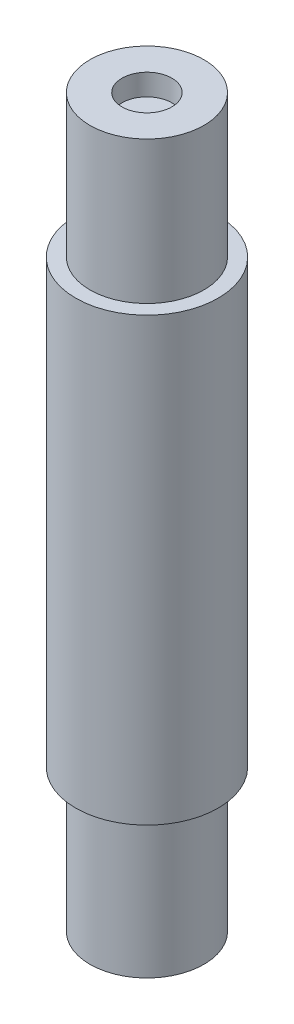
ISO-10303-21;
HEADER;
FILE_DESCRIPTION(('STEP AP214'),'2;1');
FILE_NAME('part.step','',(''),(''),'','','');
FILE_SCHEMA(('AUTOMOTIVE_DESIGN { 1 0 10303 214 1 1 1 1 }'));
ENDSEC;
DATA;
#1=APPLICATION_CONTEXT('core data for automotive mechanical design processes');
#2=APPLICATION_PROTOCOL_DEFINITION('international standard','automotive_design',2000,#1);
#3=PRODUCT_CONTEXT('',#1,'mechanical');
#4=PRODUCT('Part','Part','',(#3));
#5=PRODUCT_RELATED_PRODUCT_CATEGORY('part','',(#4));
#6=PRODUCT_DEFINITION_FORMATION('','',#4);
#7=PRODUCT_DEFINITION_CONTEXT('part definition',#1,'design');
#8=PRODUCT_DEFINITION('design','',#6,#7);
#9=PRODUCT_DEFINITION_SHAPE('','',#8);
#10=(LENGTH_UNIT() NAMED_UNIT(*) SI_UNIT(.MILLI.,.METRE.));
#11=(NAMED_UNIT(*) PLANE_ANGLE_UNIT() SI_UNIT($,.RADIAN.));
#12=(NAMED_UNIT(*) SI_UNIT($,.STERADIAN.) SOLID_ANGLE_UNIT());
#13=UNCERTAINTY_MEASURE_WITH_UNIT(LENGTH_MEASURE(1.E-05),#10,'distance_accuracy_value','');
#14=(GEOMETRIC_REPRESENTATION_CONTEXT(3) GLOBAL_UNCERTAINTY_ASSIGNED_CONTEXT((#13)) GLOBAL_UNIT_ASSIGNED_CONTEXT((#10,
#11,#12)) REPRESENTATION_CONTEXT('',''));
#15=CARTESIAN_POINT('',(0.,0.,0.));
#16=DIRECTION('',(0.,0.,1.));
#17=DIRECTION('',(1.,0.,0.));
#18=AXIS2_PLACEMENT_3D('',#15,#16,#17);
#19=CARTESIAN_POINT('',(0.,31.,0.));
#20=DIRECTION('',(0.,-1.,0.));
#21=DIRECTION('',(0.,0.,-1.));
#22=AXIS2_PLACEMENT_3D('',#19,#20,#21);
#23=CYLINDRICAL_SURFACE('',#22,5.);
#24=CARTESIAN_POINT('',(0.,31.,0.));
#25=DIRECTION('',(0.,1.,0.));
#26=DIRECTION('',(0.,0.,1.));
#27=AXIS2_PLACEMENT_3D('',#24,#25,#26);
#28=CIRCLE('',#27,5.);
#29=CARTESIAN_POINT('',(0.,31.,5.));
#30=VERTEX_POINT('',#29);
#31=EDGE_CURVE('E39',#30,#30,#28,.T.);
#32=ORIENTED_EDGE('',*,*,#31,.F.);
#33=EDGE_LOOP('',(#32));
#34=FACE_BOUND('',#33,.T.);
#35=CARTESIAN_POINT('',(0.,0.,0.));
#36=DIRECTION('',(0.,1.,0.));
#37=DIRECTION('',(0.,0.,1.));
#38=AXIS2_PLACEMENT_3D('',#35,#36,#37);
#39=CIRCLE('',#38,5.);
#40=CARTESIAN_POINT('',(0.,0.,5.));
#41=VERTEX_POINT('',#40);
#42=EDGE_CURVE('E44',#41,#41,#39,.T.);
#43=ORIENTED_EDGE('',*,*,#42,.T.);
#44=EDGE_LOOP('',(#43));
#45=FACE_BOUND('',#44,.T.);
#46=ADVANCED_FACE('F32',(#34,#45),#23,.T.);
#47=CARTESIAN_POINT('',(0.,31.,0.));
#48=DIRECTION('',(0.,1.,0.));
#49=DIRECTION('',(0.,0.,1.));
#50=AXIS2_PLACEMENT_3D('',#47,#48,#49);
#51=PLANE('',#50);
#52=CARTESIAN_POINT('',(0.,31.,0.));
#53=DIRECTION('',(0.,1.,0.));
#54=DIRECTION('',(0.,0.,1.));
#55=AXIS2_PLACEMENT_3D('',#52,#53,#54);
#56=CIRCLE('',#55,4.);
#57=CARTESIAN_POINT('',(0.,31.,4.));
#58=VERTEX_POINT('',#57);
#59=EDGE_CURVE('E11',#58,#58,#56,.T.);
#60=ORIENTED_EDGE('',*,*,#59,.F.);
#61=EDGE_LOOP('',(#60));
#62=FACE_BOUND('',#61,.T.);
#63=ORIENTED_EDGE('',*,*,#31,.T.);
#64=EDGE_LOOP('',(#63));
#65=FACE_BOUND('',#64,.T.);
#66=ADVANCED_FACE('F100',(#62,#65),#51,.T.);
#67=CARTESIAN_POINT('',(0.,0.,0.));
#68=DIRECTION('',(0.,1.,0.));
#69=DIRECTION('',(0.,0.,1.));
#70=AXIS2_PLACEMENT_3D('',#67,#68,#69);
#71=PLANE('',#70);
#72=CARTESIAN_POINT('',(0.,0.,0.));
#73=DIRECTION('',(0.,1.,0.));
#74=DIRECTION('',(0.,0.,1.));
#75=AXIS2_PLACEMENT_3D('',#72,#73,#74);
#76=CIRCLE('',#75,4.);
#77=CARTESIAN_POINT('',(0.,0.,4.));
#78=VERTEX_POINT('',#77);
#79=EDGE_CURVE('E35',#78,#78,#76,.T.);
#80=ORIENTED_EDGE('',*,*,#79,.T.);
#81=EDGE_LOOP('',(#80));
#82=FACE_BOUND('',#81,.T.);
#83=ORIENTED_EDGE('',*,*,#42,.F.);
#84=EDGE_LOOP('',(#83));
#85=FACE_BOUND('',#84,.T.);
#86=ADVANCED_FACE('F105',(#82,#85),#71,.F.);
#87=CARTESIAN_POINT('',(0.,-10.,0.));
#88=DIRECTION('',(0.,1.,0.));
#89=DIRECTION('',(0.,0.,1.));
#90=AXIS2_PLACEMENT_3D('',#87,#88,#89);
#91=PLANE('',#90);
#92=CARTESIAN_POINT('',(0.,-10.,0.));
#93=DIRECTION('',(0.,-1.,0.));
#94=DIRECTION('',(0.,0.,-1.));
#95=AXIS2_PLACEMENT_3D('',#92,#93,#94);
#96=CIRCLE('',#95,1.75);
#97=CARTESIAN_POINT('',(0.,-10.,-1.75));
#98=VERTEX_POINT('',#97);
#99=EDGE_CURVE('E64',#98,#98,#96,.T.);
#100=ORIENTED_EDGE('',*,*,#99,.F.);
#101=EDGE_LOOP('',(#100));
#102=FACE_BOUND('',#101,.T.);
#103=CARTESIAN_POINT('',(0.,-10.,0.));
#104=DIRECTION('',(0.,1.,0.));
#105=DIRECTION('',(0.,0.,1.));
#106=AXIS2_PLACEMENT_3D('',#103,#104,#105);
#107=CIRCLE('',#106,4.);
#108=CARTESIAN_POINT('',(0.,-10.,4.));
#109=VERTEX_POINT('',#108);
#110=EDGE_CURVE('E47',#109,#109,#107,.F.);
#111=ORIENTED_EDGE('',*,*,#110,.T.);
#112=EDGE_LOOP('',(#111));
#113=FACE_BOUND('',#112,.T.);
#114=ADVANCED_FACE('F113',(#102,#113),#91,.F.);
#115=CARTESIAN_POINT('',(0.,-31.3137084989848,0.));
#116=DIRECTION('',(0.,1.,0.));
#117=DIRECTION('',(0.,0.,1.));
#118=AXIS2_PLACEMENT_3D('',#115,#116,#117);
#119=CYLINDRICAL_SURFACE('',#118,4.);
#120=CARTESIAN_POINT('',(0.,-10.,4.));
#121=CARTESIAN_POINT('',(0.,-9.89583333333334,4.));
#122=CARTESIAN_POINT('',(0.,-9.79166666666667,4.));
#123=CARTESIAN_POINT('',(0.,-9.58333333333334,4.));
#124=CARTESIAN_POINT('',(0.,-9.47916666666667,4.));
#125=CARTESIAN_POINT('',(0.,-9.27083333333334,4.));
#126=CARTESIAN_POINT('',(0.,-9.16666666666667,4.));
#127=CARTESIAN_POINT('',(0.,-8.95833333333334,4.));
#128=CARTESIAN_POINT('',(0.,-8.85416666666667,4.));
#129=CARTESIAN_POINT('',(0.,-8.64583333333334,4.));
#130=CARTESIAN_POINT('',(0.,-8.54166666666667,4.));
#131=CARTESIAN_POINT('',(0.,-8.33333333333334,4.));
#132=CARTESIAN_POINT('',(0.,-8.22916666666667,4.));
#133=CARTESIAN_POINT('',(0.,-8.02083333333334,4.));
#134=CARTESIAN_POINT('',(0.,-7.91666666666667,4.));
#135=CARTESIAN_POINT('',(0.,-7.70833333333334,4.));
#136=CARTESIAN_POINT('',(0.,-7.60416666666667,4.));
#137=CARTESIAN_POINT('',(0.,-7.39583333333334,4.));
#138=CARTESIAN_POINT('',(0.,-7.29166666666667,4.));
#139=CARTESIAN_POINT('',(0.,-7.08333333333334,4.));
#140=CARTESIAN_POINT('',(0.,-6.97916666666667,4.));
#141=CARTESIAN_POINT('',(0.,-6.77083333333334,4.));
#142=CARTESIAN_POINT('',(0.,-6.66666666666667,4.));
#143=CARTESIAN_POINT('',(0.,-6.45833333333334,4.));
#144=CARTESIAN_POINT('',(0.,-6.35416666666667,4.));
#145=CARTESIAN_POINT('',(0.,-6.14583333333334,4.));
#146=CARTESIAN_POINT('',(0.,-6.04166666666667,4.));
#147=CARTESIAN_POINT('',(0.,-5.83333333333334,4.));
#148=CARTESIAN_POINT('',(0.,-5.72916666666667,4.));
#149=CARTESIAN_POINT('',(0.,-5.52083333333334,4.));
#150=CARTESIAN_POINT('',(0.,-5.41666666666667,4.));
#151=CARTESIAN_POINT('',(0.,-5.20833333333334,4.));
#152=CARTESIAN_POINT('',(0.,-5.10416666666667,4.));
#153=CARTESIAN_POINT('',(0.,-4.89583333333334,4.));
#154=CARTESIAN_POINT('',(0.,-4.79166666666667,4.));
#155=CARTESIAN_POINT('',(0.,-4.58333333333334,4.));
#156=CARTESIAN_POINT('',(0.,-4.47916666666667,4.));
#157=CARTESIAN_POINT('',(0.,-4.27083333333334,4.));
#158=CARTESIAN_POINT('',(0.,-4.16666666666667,4.));
#159=CARTESIAN_POINT('',(0.,-3.95833333333334,4.));
#160=CARTESIAN_POINT('',(0.,-3.85416666666667,4.));
#161=CARTESIAN_POINT('',(0.,-3.64583333333334,4.));
#162=CARTESIAN_POINT('',(0.,-3.54166666666667,4.));
#163=CARTESIAN_POINT('',(0.,-3.33333333333334,4.));
#164=CARTESIAN_POINT('',(0.,-3.22916666666667,4.));
#165=CARTESIAN_POINT('',(0.,-3.02083333333334,4.));
#166=CARTESIAN_POINT('',(0.,-2.91666666666667,4.));
#167=CARTESIAN_POINT('',(0.,-2.70833333333334,4.));
#168=CARTESIAN_POINT('',(0.,-2.60416666666667,4.));
#169=CARTESIAN_POINT('',(0.,-2.39583333333334,4.));
#170=CARTESIAN_POINT('',(0.,-2.29166666666667,4.));
#171=CARTESIAN_POINT('',(0.,-2.08333333333334,4.));
#172=CARTESIAN_POINT('',(0.,-1.97916666666667,4.));
#173=CARTESIAN_POINT('',(0.,-1.77083333333334,4.));
#174=CARTESIAN_POINT('',(0.,-1.66666666666667,4.));
#175=CARTESIAN_POINT('',(0.,-1.45833333333334,4.));
#176=CARTESIAN_POINT('',(0.,-1.35416666666667,4.));
#177=CARTESIAN_POINT('',(0.,-1.14583333333334,4.));
#178=CARTESIAN_POINT('',(0.,-1.04166666666667,4.));
#179=CARTESIAN_POINT('',(0.,-0.833333333333337,4.));
#180=CARTESIAN_POINT('',(0.,-0.729166666666671,4.));
#181=CARTESIAN_POINT('',(0.,-0.520833333333337,4.));
#182=CARTESIAN_POINT('',(0.,-0.416666666666671,4.));
#183=CARTESIAN_POINT('',(0.,-0.208333333333338,4.));
#184=CARTESIAN_POINT('',(0.,-0.104166666666672,4.));
#185=CARTESIAN_POINT('',(0.,0.,4.));
#186=B_SPLINE_CURVE_WITH_KNOTS('',3,(#120,#121,#122,#123,#124,#125,#126,#127,#128,#129,#130,
#131,#132,#133,#134,#135,#136,#137,#138,#139,#140,#141,#142,#143,#144,#145,#146,#147,#148,#149,
#150,#151,#152,#153,#154,#155,#156,#157,#158,#159,#160,#161,#162,#163,#164,#165,#166,#167,#168,
#169,#170,#171,#172,#173,#174,#175,#176,#177,#178,#179,#180,#181,#182,#183,#184,#185),
.UNSPECIFIED.,.F.,.F.,(4,2,2,2,2,2,2,2,2,2,2,2,2,2,2,2,2,2,2,2,2,2,2,2,2,2,2,2,2,2,2,2,4),(0.,
0.3125,0.625000000000001,0.937500000000001,1.25,1.5625,1.875,2.1875,2.5,2.8125,3.125,3.4375,
3.75,4.0625,4.375,4.6875,5.,5.3125,5.625,5.9375,6.25,6.5625,6.875,7.1875,7.5,7.8125,8.125,
8.4375,8.75,9.0625,9.375,9.6875,10.),.UNSPECIFIED.);
#187=EDGE_CURVE('BSEAM96',#109,#78,#186,.T.);
#188=ORIENTED_EDGE('',*,*,#110,.F.);
#189=ORIENTED_EDGE('',*,*,#79,.F.);
#190=ORIENTED_EDGE('',*,*,#187,.T.);
#191=ORIENTED_EDGE('',*,*,#187,.F.);
#192=EDGE_LOOP('',(#188,#190,#189,#191));
#193=FACE_BOUND('',#192,.T.);
#194=ADVANCED_FACE('F96',(#193),#119,.T.);
#195=CARTESIAN_POINT('',(0.,41.,0.));
#196=DIRECTION('',(0.,1.,0.));
#197=DIRECTION('',(0.,0.,1.));
#198=AXIS2_PLACEMENT_3D('',#195,#196,#197);
#199=CIRCLE('',#198,4.);
#200=CARTESIAN_POINT('',(0.,41.,4.));
#201=VERTEX_POINT('',#200);
#202=EDGE_CURVE('E56',#201,#201,#199,.T.);
#203=CARTESIAN_POINT('',(0.,31.,4.));
#204=CARTESIAN_POINT('',(0.,31.1041666666667,4.));
#205=CARTESIAN_POINT('',(0.,31.2083333333333,4.));
#206=CARTESIAN_POINT('',(0.,31.4166666666667,4.));
#207=CARTESIAN_POINT('',(0.,31.5208333333333,4.));
#208=CARTESIAN_POINT('',(0.,31.7291666666667,4.));
#209=CARTESIAN_POINT('',(0.,31.8333333333333,4.));
#210=CARTESIAN_POINT('',(0.,32.0416666666667,4.));
#211=CARTESIAN_POINT('',(0.,32.1458333333333,4.));
#212=CARTESIAN_POINT('',(0.,32.3541666666667,4.));
#213=CARTESIAN_POINT('',(0.,32.4583333333333,4.));
#214=CARTESIAN_POINT('',(0.,32.6666666666667,4.));
#215=CARTESIAN_POINT('',(0.,32.7708333333333,4.));
#216=CARTESIAN_POINT('',(0.,32.9791666666667,4.));
#217=CARTESIAN_POINT('',(0.,33.0833333333333,4.));
#218=CARTESIAN_POINT('',(0.,33.2916666666667,4.));
#219=CARTESIAN_POINT('',(0.,33.3958333333333,4.));
#220=CARTESIAN_POINT('',(0.,33.6041666666667,4.));
#221=CARTESIAN_POINT('',(0.,33.7083333333333,4.));
#222=CARTESIAN_POINT('',(0.,33.9166666666667,4.));
#223=CARTESIAN_POINT('',(0.,34.0208333333333,4.));
#224=CARTESIAN_POINT('',(0.,34.2291666666667,4.));
#225=CARTESIAN_POINT('',(0.,34.3333333333333,4.));
#226=CARTESIAN_POINT('',(0.,34.5416666666667,4.));
#227=CARTESIAN_POINT('',(0.,34.6458333333333,4.));
#228=CARTESIAN_POINT('',(0.,34.8541666666667,4.));
#229=CARTESIAN_POINT('',(0.,34.9583333333333,4.));
#230=CARTESIAN_POINT('',(0.,35.1666666666667,4.));
#231=CARTESIAN_POINT('',(0.,35.2708333333333,4.));
#232=CARTESIAN_POINT('',(0.,35.4791666666667,4.));
#233=CARTESIAN_POINT('',(0.,35.5833333333333,4.));
#234=CARTESIAN_POINT('',(0.,35.7916666666667,4.));
#235=CARTESIAN_POINT('',(0.,35.8958333333333,4.));
#236=CARTESIAN_POINT('',(0.,36.1041666666667,4.));
#237=CARTESIAN_POINT('',(0.,36.2083333333333,4.));
#238=CARTESIAN_POINT('',(0.,36.4166666666667,4.));
#239=CARTESIAN_POINT('',(0.,36.5208333333333,4.));
#240=CARTESIAN_POINT('',(0.,36.7291666666667,4.));
#241=CARTESIAN_POINT('',(0.,36.8333333333333,4.));
#242=CARTESIAN_POINT('',(0.,37.0416666666667,4.));
#243=CARTESIAN_POINT('',(0.,37.1458333333333,4.));
#244=CARTESIAN_POINT('',(0.,37.3541666666667,4.));
#245=CARTESIAN_POINT('',(0.,37.4583333333333,4.));
#246=CARTESIAN_POINT('',(0.,37.6666666666667,4.));
#247=CARTESIAN_POINT('',(0.,37.7708333333333,4.));
#248=CARTESIAN_POINT('',(0.,37.9791666666667,4.));
#249=CARTESIAN_POINT('',(0.,38.0833333333333,4.));
#250=CARTESIAN_POINT('',(0.,38.2916666666667,4.));
#251=CARTESIAN_POINT('',(0.,38.3958333333333,4.));
#252=CARTESIAN_POINT('',(0.,38.6041666666667,4.));
#253=CARTESIAN_POINT('',(0.,38.7083333333333,4.));
#254=CARTESIAN_POINT('',(0.,38.9166666666667,4.));
#255=CARTESIAN_POINT('',(0.,39.0208333333333,4.));
#256=CARTESIAN_POINT('',(0.,39.2291666666667,4.));
#257=CARTESIAN_POINT('',(0.,39.3333333333333,4.));
#258=CARTESIAN_POINT('',(0.,39.5416666666667,4.));
#259=CARTESIAN_POINT('',(0.,39.6458333333333,4.));
#260=CARTESIAN_POINT('',(0.,39.8541666666667,4.));
#261=CARTESIAN_POINT('',(0.,39.9583333333333,4.));
#262=CARTESIAN_POINT('',(0.,40.1666666666667,4.));
#263=CARTESIAN_POINT('',(0.,40.2708333333333,4.));
#264=CARTESIAN_POINT('',(0.,40.4791666666667,4.));
#265=CARTESIAN_POINT('',(0.,40.5833333333333,4.));
#266=CARTESIAN_POINT('',(0.,40.7916666666667,4.));
#267=CARTESIAN_POINT('',(0.,40.8958333333333,4.));
#268=CARTESIAN_POINT('',(0.,41.,4.));
#269=B_SPLINE_CURVE_WITH_KNOTS('',3,(#203,#204,#205,#206,#207,#208,#209,#210,#211,#212,#213,
#214,#215,#216,#217,#218,#219,#220,#221,#222,#223,#224,#225,#226,#227,#228,#229,#230,#231,#232,
#233,#234,#235,#236,#237,#238,#239,#240,#241,#242,#243,#244,#245,#246,#247,#248,#249,#250,#251,
#252,#253,#254,#255,#256,#257,#258,#259,#260,#261,#262,#263,#264,#265,#266,#267,#268),
.UNSPECIFIED.,.F.,.F.,(4,2,2,2,2,2,2,2,2,2,2,2,2,2,2,2,2,2,2,2,2,2,2,2,2,2,2,2,2,2,2,2,4),(0.,
0.312499999999986,0.624999999999994,0.937500000000001,1.24999999999999,1.56249999999999,
1.87499999999999,2.1875,2.5,2.81249999999999,3.125,3.4375,3.75,4.06249999999999,4.375,4.6875,5.,
5.31249999999999,5.625,5.93750000000001,6.25,6.56249999999999,6.875,7.18750000000001,7.5,
7.81249999999999,8.125,8.43750000000001,8.75,9.06249999999999,9.375,9.68750000000001,10.),.UNSPECIFIED.);
#270=EDGE_CURVE('BSEAM88',#58,#201,#269,.T.);
#271=ORIENTED_EDGE('',*,*,#59,.T.);
#272=ORIENTED_EDGE('',*,*,#202,.F.);
#273=ORIENTED_EDGE('',*,*,#270,.T.);
#274=ORIENTED_EDGE('',*,*,#270,.F.);
#275=EDGE_LOOP('',(#271,#273,#272,#274));
#276=FACE_BOUND('',#275,.T.);
#277=ADVANCED_FACE('F88',(#276),#119,.T.);
#278=CARTESIAN_POINT('',(0.,41.,0.));
#279=DIRECTION('',(0.,1.,0.));
#280=DIRECTION('',(0.,0.,1.));
#281=AXIS2_PLACEMENT_3D('',#278,#279,#280);
#282=PLANE('',#281);
#283=CARTESIAN_POINT('',(0.,41.,0.));
#284=DIRECTION('',(0.,1.,0.));
#285=DIRECTION('',(0.,0.,1.));
#286=AXIS2_PLACEMENT_3D('',#283,#284,#285);
#287=CIRCLE('',#286,1.75);
#288=CARTESIAN_POINT('',(0.,41.,1.75));
#289=VERTEX_POINT('',#288);
#290=EDGE_CURVE('E70',#289,#289,#287,.T.);
#291=ORIENTED_EDGE('',*,*,#290,.F.);
#292=EDGE_LOOP('',(#291));
#293=FACE_BOUND('',#292,.T.);
#294=ORIENTED_EDGE('',*,*,#202,.T.);
#295=EDGE_LOOP('',(#294));
#296=FACE_BOUND('',#295,.T.);
#297=ADVANCED_FACE('F85',(#293,#296),#282,.T.);
#298=CARTESIAN_POINT('',(0.,-8.5,0.));
#299=DIRECTION('',(0.,-1.,0.));
#300=DIRECTION('',(0.,0.,-1.));
#301=AXIS2_PLACEMENT_3D('',#298,#299,#300);
#302=CYLINDRICAL_SURFACE('',#301,1.75);
#303=CARTESIAN_POINT('',(0.,-8.5,0.));
#304=DIRECTION('',(0.,-1.,0.));
#305=DIRECTION('',(0.,0.,-1.));
#306=AXIS2_PLACEMENT_3D('',#303,#304,#305);
#307=CIRCLE('',#306,1.75);
#308=CARTESIAN_POINT('',(0.,-8.5,-1.75));
#309=VERTEX_POINT('',#308);
#310=EDGE_CURVE('E60',#309,#309,#307,.T.);
#311=ORIENTED_EDGE('',*,*,#310,.F.);
#312=EDGE_LOOP('',(#311));
#313=FACE_BOUND('',#312,.T.);
#314=ORIENTED_EDGE('',*,*,#99,.T.);
#315=EDGE_LOOP('',(#314));
#316=FACE_BOUND('',#315,.T.);
#317=ADVANCED_FACE('F87',(#313,#316),#302,.F.);
#318=CARTESIAN_POINT('',(0.,-8.5,0.));
#319=DIRECTION('',(0.,-1.,0.));
#320=DIRECTION('',(0.,0.,-1.));
#321=AXIS2_PLACEMENT_3D('',#318,#319,#320);
#322=PLANE('',#321);
#323=ORIENTED_EDGE('',*,*,#310,.T.);
#324=EDGE_LOOP('',(#323));
#325=FACE_BOUND('',#324,.T.);
#326=ADVANCED_FACE('F81',(#325),#322,.T.);
#327=CARTESIAN_POINT('',(0.,39.5,0.));
#328=DIRECTION('',(0.,1.,0.));
#329=DIRECTION('',(0.,0.,1.));
#330=AXIS2_PLACEMENT_3D('',#327,#328,#329);
#331=CYLINDRICAL_SURFACE('',#330,1.75);
#332=CARTESIAN_POINT('',(0.,39.5,0.));
#333=DIRECTION('',(0.,1.,0.));
#334=DIRECTION('',(0.,0.,1.));
#335=AXIS2_PLACEMENT_3D('',#332,#333,#334);
#336=CIRCLE('',#335,1.75);
#337=CARTESIAN_POINT('',(0.,39.5,1.75));
#338=VERTEX_POINT('',#337);
#339=EDGE_CURVE('E68',#338,#338,#336,.T.);
#340=ORIENTED_EDGE('',*,*,#339,.F.);
#341=EDGE_LOOP('',(#340));
#342=FACE_BOUND('',#341,.T.);
#343=ORIENTED_EDGE('',*,*,#290,.T.);
#344=EDGE_LOOP('',(#343));
#345=FACE_BOUND('',#344,.T.);
#346=ADVANCED_FACE('F78',(#342,#345),#331,.F.);
#347=CARTESIAN_POINT('',(0.,39.5,0.));
#348=DIRECTION('',(0.,1.,0.));
#349=DIRECTION('',(0.,0.,1.));
#350=AXIS2_PLACEMENT_3D('',#347,#348,#349);
#351=PLANE('',#350);
#352=ORIENTED_EDGE('',*,*,#339,.T.);
#353=EDGE_LOOP('',(#352));
#354=FACE_BOUND('',#353,.T.);
#355=ADVANCED_FACE('F76',(#354),#351,.T.);
#356=CLOSED_SHELL('',(#46,#66,#86,#114,#194,#277,#297,#317,#326,#346,#355));
#357=MANIFOLD_SOLID_BREP('B2',#356);
#358=ADVANCED_BREP_SHAPE_REPRESENTATION('',(#18,#357),#14);
#359=SHAPE_DEFINITION_REPRESENTATION(#9,#358);
ENDSEC;
END-ISO-10303-21;
